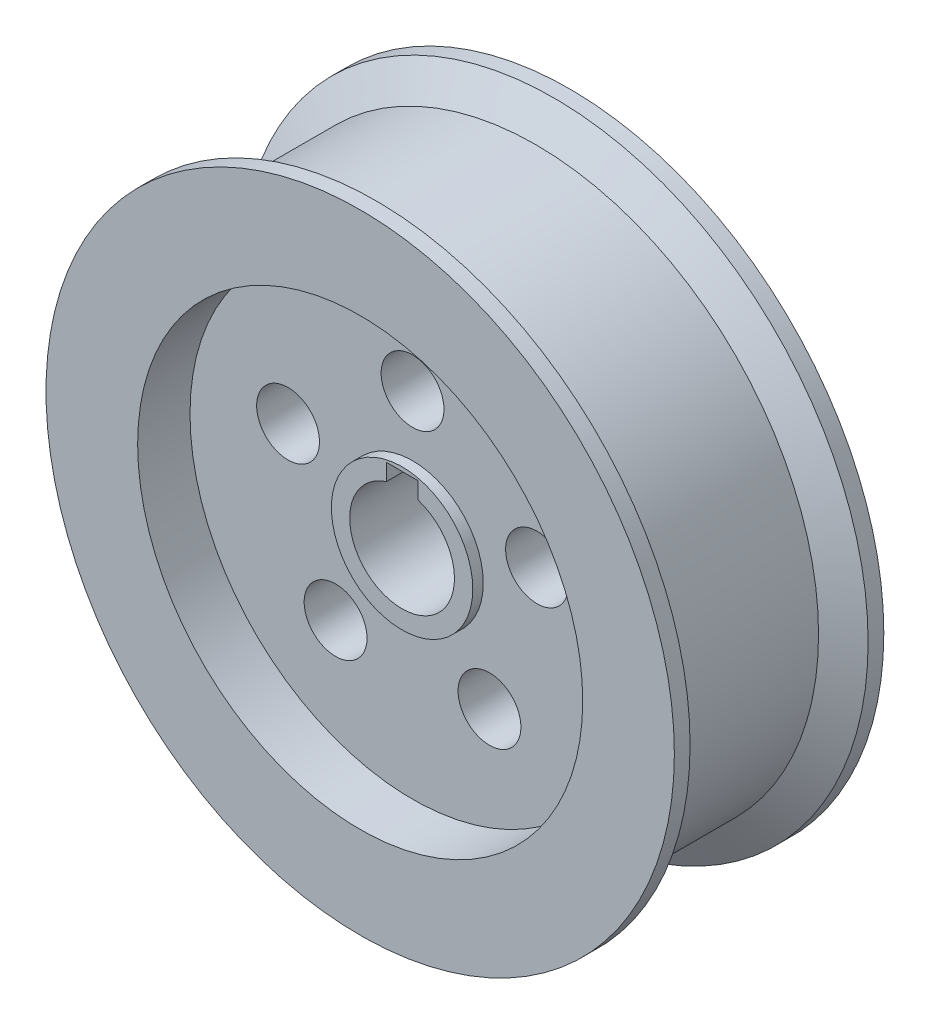
ISO-10303-21;
HEADER;
FILE_DESCRIPTION(('STEP AP214'),'2;1');
FILE_NAME('part.step','',(''),(''),'','','');
FILE_SCHEMA(('AUTOMOTIVE_DESIGN { 1 0 10303 214 1 1 1 1 }'));
ENDSEC;
DATA;
#1=APPLICATION_CONTEXT('core data for automotive mechanical design processes');
#2=APPLICATION_PROTOCOL_DEFINITION('international standard','automotive_design',2000,#1);
#3=PRODUCT_CONTEXT('',#1,'mechanical');
#4=PRODUCT('Part','Part','',(#3));
#5=PRODUCT_RELATED_PRODUCT_CATEGORY('part','',(#4));
#6=PRODUCT_DEFINITION_FORMATION('','',#4);
#7=PRODUCT_DEFINITION_CONTEXT('part definition',#1,'design');
#8=PRODUCT_DEFINITION('design','',#6,#7);
#9=PRODUCT_DEFINITION_SHAPE('','',#8);
#10=(LENGTH_UNIT() NAMED_UNIT(*) SI_UNIT(.MILLI.,.METRE.));
#11=(NAMED_UNIT(*) PLANE_ANGLE_UNIT() SI_UNIT($,.RADIAN.));
#12=(NAMED_UNIT(*) SI_UNIT($,.STERADIAN.) SOLID_ANGLE_UNIT());
#13=UNCERTAINTY_MEASURE_WITH_UNIT(LENGTH_MEASURE(1.E-05),#10,'distance_accuracy_value','');
#14=(GEOMETRIC_REPRESENTATION_CONTEXT(3) GLOBAL_UNCERTAINTY_ASSIGNED_CONTEXT((#13)) GLOBAL_UNIT_ASSIGNED_CONTEXT((#10,
#11,#12)) REPRESENTATION_CONTEXT('',''));
#15=CARTESIAN_POINT('',(0.,0.,0.));
#16=DIRECTION('',(0.,0.,1.));
#17=DIRECTION('',(1.,0.,0.));
#18=AXIS2_PLACEMENT_3D('',#15,#16,#17);
#19=CARTESIAN_POINT('',(0.,0.,20.));
#20=DIRECTION('',(0.,0.,-1.));
#21=DIRECTION('',(-1.,0.,0.));
#22=AXIS2_PLACEMENT_3D('',#19,#20,#21);
#23=CYLINDRICAL_SURFACE('',#22,60.);
#24=CARTESIAN_POINT('',(0.,0.,-17.));
#25=DIRECTION('',(0.,0.,1.));
#26=DIRECTION('',(1.,0.,0.));
#27=AXIS2_PLACEMENT_3D('',#24,#25,#26);
#28=CIRCLE('',#27,60.);
#29=CARTESIAN_POINT('',(60.,0.,-17.));
#30=VERTEX_POINT('',#29);
#31=EDGE_CURVE('E115',#30,#30,#28,.T.);
#32=ORIENTED_EDGE('',*,*,#31,.F.);
#33=EDGE_LOOP('',(#32));
#34=FACE_BOUND('',#33,.T.);
#35=CARTESIAN_POINT('',(0.,0.,-20.));
#36=DIRECTION('',(0.,0.,1.));
#37=DIRECTION('',(1.,0.,0.));
#38=AXIS2_PLACEMENT_3D('',#35,#36,#37);
#39=CIRCLE('',#38,60.);
#40=CARTESIAN_POINT('',(60.,0.,-20.));
#41=VERTEX_POINT('',#40);
#42=EDGE_CURVE('E150',#41,#41,#39,.T.);
#43=ORIENTED_EDGE('',*,*,#42,.T.);
#44=EDGE_LOOP('',(#43));
#45=FACE_BOUND('',#44,.T.);
#46=ADVANCED_FACE('F38',(#34,#45),#23,.T.);
#47=CARTESIAN_POINT('',(0.,0.,20.));
#48=DIRECTION('',(0.,0.,-1.));
#49=DIRECTION('',(-1.,0.,0.));
#50=AXIS2_PLACEMENT_3D('',#47,#48,#49);
#51=CYLINDRICAL_SURFACE('',#50,10.);
#52=DIRECTION('',(0.,0.,-1.));
#53=VECTOR('',#52,1.);
#54=CARTESIAN_POINT('',(-3.,9.53939201416946,20.));
#55=LINE('',#54,#53);
#56=CARTESIAN_POINT('',(-3.,9.53939201416946,12.));
#57=VERTEX_POINT('',#56);
#58=CARTESIAN_POINT('',(-3.,9.53939201416946,-10.));
#59=VERTEX_POINT('',#58);
#60=EDGE_CURVE('E60',#57,#59,#55,.T.);
#61=ORIENTED_EDGE('',*,*,#60,.F.);
#62=CARTESIAN_POINT('',(0.,0.,12.));
#63=DIRECTION('',(0.,0.,1.));
#64=DIRECTION('',(1.,0.,0.));
#65=AXIS2_PLACEMENT_3D('',#62,#63,#64);
#66=CIRCLE('',#65,10.);
#67=CARTESIAN_POINT('',(3.,9.53939201416946,12.));
#68=VERTEX_POINT('',#67);
#69=EDGE_CURVE('E103',#57,#68,#66,.T.);
#70=ORIENTED_EDGE('',*,*,#69,.T.);
#71=DIRECTION('',(0.,0.,-1.));
#72=VECTOR('',#71,1.);
#73=CARTESIAN_POINT('',(3.,9.53939201416946,20.));
#74=LINE('',#73,#72);
#75=CARTESIAN_POINT('',(3.,9.53939201416946,-10.));
#76=VERTEX_POINT('',#75);
#77=EDGE_CURVE('E83',#76,#68,#74,.F.);
#78=ORIENTED_EDGE('',*,*,#77,.F.);
#79=CARTESIAN_POINT('',(0.,0.,-10.));
#80=DIRECTION('',(0.,0.,-1.));
#81=DIRECTION('',(-1.,0.,0.));
#82=AXIS2_PLACEMENT_3D('',#79,#80,#81);
#83=CIRCLE('',#82,10.);
#84=EDGE_CURVE('E96',#76,#59,#83,.T.);
#85=ORIENTED_EDGE('',*,*,#84,.T.);
#86=EDGE_LOOP('',(#61,#70,#78,#85));
#87=FACE_BOUND('',#86,.T.);
#88=ADVANCED_FACE('F182',(#87),#51,.F.);
#89=CARTESIAN_POINT('',(0.,0.,20.));
#90=DIRECTION('',(0.,0.,1.));
#91=DIRECTION('',(1.,0.,0.));
#92=AXIS2_PLACEMENT_3D('',#89,#90,#91);
#93=PLANE('',#92);
#94=CARTESIAN_POINT('',(0.,0.,20.));
#95=DIRECTION('',(0.,0.,1.));
#96=DIRECTION('',(1.,0.,0.));
#97=AXIS2_PLACEMENT_3D('',#94,#95,#96);
#98=CIRCLE('',#97,42.5);
#99=CARTESIAN_POINT('',(42.5,0.,20.));
#100=VERTEX_POINT('',#99);
#101=EDGE_CURVE('E151',#100,#100,#98,.T.);
#102=ORIENTED_EDGE('',*,*,#101,.F.);
#103=EDGE_LOOP('',(#102));
#104=FACE_BOUND('',#103,.T.);
#105=CARTESIAN_POINT('',(0.,0.,20.));
#106=DIRECTION('',(0.,0.,1.));
#107=DIRECTION('',(1.,0.,0.));
#108=AXIS2_PLACEMENT_3D('',#105,#106,#107);
#109=CIRCLE('',#108,60.);
#110=CARTESIAN_POINT('',(60.,0.,20.));
#111=VERTEX_POINT('',#110);
#112=EDGE_CURVE('E154',#111,#111,#109,.T.);
#113=ORIENTED_EDGE('',*,*,#112,.T.);
#114=EDGE_LOOP('',(#113));
#115=FACE_BOUND('',#114,.T.);
#116=ADVANCED_FACE('F184',(#104,#115),#93,.T.);
#117=CARTESIAN_POINT('',(0.,0.,-20.));
#118=DIRECTION('',(0.,0.,1.));
#119=DIRECTION('',(1.,0.,0.));
#120=AXIS2_PLACEMENT_3D('',#117,#118,#119);
#121=PLANE('',#120);
#122=CARTESIAN_POINT('',(0.,0.,-20.));
#123=DIRECTION('',(0.,0.,1.));
#124=DIRECTION('',(1.,0.,0.));
#125=AXIS2_PLACEMENT_3D('',#122,#123,#124);
#126=CIRCLE('',#125,42.5);
#127=CARTESIAN_POINT('',(42.5,0.,-20.));
#128=VERTEX_POINT('',#127);
#129=EDGE_CURVE('E141',#128,#128,#126,.T.);
#130=ORIENTED_EDGE('',*,*,#129,.T.);
#131=EDGE_LOOP('',(#130));
#132=FACE_BOUND('',#131,.T.);
#133=ORIENTED_EDGE('',*,*,#42,.F.);
#134=EDGE_LOOP('',(#133));
#135=FACE_BOUND('',#134,.T.);
#136=ADVANCED_FACE('F190',(#132,#135),#121,.F.);
#137=CARTESIAN_POINT('',(0.,0.,17.));
#138=DIRECTION('',(0.,0.,1.));
#139=DIRECTION('',(1.,0.,0.));
#140=AXIS2_PLACEMENT_3D('',#137,#138,#139);
#141=CIRCLE('',#140,60.);
#142=CARTESIAN_POINT('',(60.,0.,17.));
#143=VERTEX_POINT('',#142);
#144=EDGE_CURVE('E112',#143,#143,#141,.T.);
#145=ORIENTED_EDGE('',*,*,#144,.T.);
#146=EDGE_LOOP('',(#145));
#147=FACE_BOUND('',#146,.T.);
#148=ORIENTED_EDGE('',*,*,#112,.F.);
#149=EDGE_LOOP('',(#148));
#150=FACE_BOUND('',#149,.T.);
#151=ADVANCED_FACE('F40',(#147,#150),#23,.T.);
#152=CARTESIAN_POINT('',(0.,0.,10.));
#153=DIRECTION('',(0.,0.,1.));
#154=DIRECTION('',(1.,0.,0.));
#155=AXIS2_PLACEMENT_3D('',#152,#153,#154);
#156=CYLINDRICAL_SURFACE('',#155,42.5);
#157=CARTESIAN_POINT('',(0.,0.,10.));
#158=DIRECTION('',(0.,0.,1.));
#159=DIRECTION('',(1.,0.,0.));
#160=AXIS2_PLACEMENT_3D('',#157,#158,#159);
#161=CIRCLE('',#160,42.5);
#162=CARTESIAN_POINT('',(42.5,0.,10.));
#163=VERTEX_POINT('',#162);
#164=EDGE_CURVE('E147',#163,#163,#161,.T.);
#165=ORIENTED_EDGE('',*,*,#164,.F.);
#166=EDGE_LOOP('',(#165));
#167=FACE_BOUND('',#166,.T.);
#168=ORIENTED_EDGE('',*,*,#101,.T.);
#169=EDGE_LOOP('',(#168));
#170=FACE_BOUND('',#169,.T.);
#171=ADVANCED_FACE('F195',(#167,#170),#156,.F.);
#172=CARTESIAN_POINT('',(0.,0.,10.));
#173=DIRECTION('',(0.,0.,1.));
#174=DIRECTION('',(1.,0.,0.));
#175=AXIS2_PLACEMENT_3D('',#172,#173,#174);
#176=PLANE('',#175);
#177=CARTESIAN_POINT('',(0.,0.,10.));
#178=DIRECTION('',(0.,0.,1.));
#179=DIRECTION('',(1.,0.,0.));
#180=AXIS2_PLACEMENT_3D('',#177,#178,#179);
#181=CIRCLE('',#180,13.5);
#182=CARTESIAN_POINT('',(13.5,0.,10.));
#183=VERTEX_POINT('',#182);
#184=EDGE_CURVE('E157',#183,#183,#181,.T.);
#185=ORIENTED_EDGE('',*,*,#184,.F.);
#186=EDGE_LOOP('',(#185));
#187=FACE_BOUND('',#186,.T.);
#188=CARTESIAN_POINT('',(14.6946313073117,-20.2254248593738,10.));
#189=DIRECTION('',(0.,0.,1.));
#190=DIRECTION('',(1.,0.,0.));
#191=AXIS2_PLACEMENT_3D('',#188,#189,#190);
#192=CIRCLE('',#191,6.);
#193=CARTESIAN_POINT('',(20.6946313073117,-20.2254248593738,10.));
#194=VERTEX_POINT('',#193);
#195=EDGE_CURVE('E130',#194,#194,#192,.T.);
#196=ORIENTED_EDGE('',*,*,#195,.F.);
#197=EDGE_LOOP('',(#196));
#198=FACE_BOUND('',#197,.T.);
#199=CARTESIAN_POINT('',(-14.694631307312,-20.2254248593736,10.));
#200=DIRECTION('',(0.,0.,1.));
#201=DIRECTION('',(1.,0.,0.));
#202=AXIS2_PLACEMENT_3D('',#199,#200,#201);
#203=CIRCLE('',#202,6.);
#204=CARTESIAN_POINT('',(-8.69463130731201,-20.2254248593736,10.));
#205=VERTEX_POINT('',#204);
#206=EDGE_CURVE('E126',#205,#205,#203,.T.);
#207=ORIENTED_EDGE('',*,*,#206,.F.);
#208=EDGE_LOOP('',(#207));
#209=FACE_BOUND('',#208,.T.);
#210=CARTESIAN_POINT('',(-23.7764129073788,7.72542485937396,10.));
#211=DIRECTION('',(0.,0.,1.));
#212=DIRECTION('',(1.,0.,0.));
#213=AXIS2_PLACEMENT_3D('',#210,#211,#212);
#214=CIRCLE('',#213,6.);
#215=CARTESIAN_POINT('',(-17.7764129073787,7.72542485937396,10.));
#216=VERTEX_POINT('',#215);
#217=EDGE_CURVE('E122',#216,#216,#214,.T.);
#218=ORIENTED_EDGE('',*,*,#217,.F.);
#219=EDGE_LOOP('',(#218));
#220=FACE_BOUND('',#219,.T.);
#221=CARTESIAN_POINT('',(23.7764129073789,7.72542485937362,10.));
#222=DIRECTION('',(0.,0.,1.));
#223=DIRECTION('',(1.,0.,0.));
#224=AXIS2_PLACEMENT_3D('',#221,#222,#223);
#225=CIRCLE('',#224,6.);
#226=CARTESIAN_POINT('',(29.7764129073789,7.72542485937362,10.));
#227=VERTEX_POINT('',#226);
#228=EDGE_CURVE('E134',#227,#227,#225,.T.);
#229=ORIENTED_EDGE('',*,*,#228,.F.);
#230=EDGE_LOOP('',(#229));
#231=FACE_BOUND('',#230,.T.);
#232=CARTESIAN_POINT('',(0.,25.,10.));
#233=DIRECTION('',(0.,0.,1.));
#234=DIRECTION('',(1.,0.,0.));
#235=AXIS2_PLACEMENT_3D('',#232,#233,#234);
#236=CIRCLE('',#235,6.);
#237=CARTESIAN_POINT('',(6.,25.,10.));
#238=VERTEX_POINT('',#237);
#239=EDGE_CURVE('E138',#238,#238,#236,.T.);
#240=ORIENTED_EDGE('',*,*,#239,.F.);
#241=EDGE_LOOP('',(#240));
#242=FACE_BOUND('',#241,.T.);
#243=ORIENTED_EDGE('',*,*,#164,.T.);
#244=EDGE_LOOP('',(#243));
#245=FACE_BOUND('',#244,.T.);
#246=ADVANCED_FACE('F210',(#187,#198,#209,#220,#231,#242,#245),#176,.T.);
#247=CARTESIAN_POINT('',(0.,0.,-10.));
#248=DIRECTION('',(0.,0.,-1.));
#249=DIRECTION('',(-1.,0.,0.));
#250=AXIS2_PLACEMENT_3D('',#247,#248,#249);
#251=CYLINDRICAL_SURFACE('',#250,42.5);
#252=CARTESIAN_POINT('',(0.,0.,-10.));
#253=DIRECTION('',(0.,0.,1.));
#254=DIRECTION('',(1.,0.,0.));
#255=AXIS2_PLACEMENT_3D('',#252,#253,#254);
#256=CIRCLE('',#255,42.5);
#257=CARTESIAN_POINT('',(42.5,0.,-10.));
#258=VERTEX_POINT('',#257);
#259=EDGE_CURVE('E142',#258,#258,#256,.T.);
#260=ORIENTED_EDGE('',*,*,#259,.T.);
#261=EDGE_LOOP('',(#260));
#262=FACE_BOUND('',#261,.T.);
#263=ORIENTED_EDGE('',*,*,#129,.F.);
#264=EDGE_LOOP('',(#263));
#265=FACE_BOUND('',#264,.T.);
#266=ADVANCED_FACE('F208',(#262,#265),#251,.F.);
#267=CARTESIAN_POINT('',(0.,0.,-10.));
#268=DIRECTION('',(0.,0.,-1.));
#269=DIRECTION('',(1.,0.,0.));
#270=AXIS2_PLACEMENT_3D('',#267,#268,#269);
#271=PLANE('',#270);
#272=DIRECTION('',(0.,1.,0.));
#273=VECTOR('',#272,1.);
#274=CARTESIAN_POINT('',(-3.,0.,-10.));
#275=LINE('',#274,#273);
#276=CARTESIAN_POINT('',(-3.,12.7268825510784,-10.));
#277=VERTEX_POINT('',#276);
#278=EDGE_CURVE('E98',#59,#277,#275,.T.);
#279=ORIENTED_EDGE('',*,*,#278,.F.);
#280=ORIENTED_EDGE('',*,*,#84,.F.);
#281=DIRECTION('',(0.,-1.,0.));
#282=VECTOR('',#281,1.);
#283=CARTESIAN_POINT('',(3.,0.,-10.));
#284=LINE('',#283,#282);
#285=CARTESIAN_POINT('',(3.,12.7268825510784,-10.));
#286=VERTEX_POINT('',#285);
#287=EDGE_CURVE('E87',#286,#76,#284,.T.);
#288=ORIENTED_EDGE('',*,*,#287,.F.);
#289=DIRECTION('',(1.,0.,0.));
#290=VECTOR('',#289,1.);
#291=CARTESIAN_POINT('',(0.,12.7268825510784,-10.));
#292=LINE('',#291,#290);
#293=EDGE_CURVE('E77',#277,#286,#292,.T.);
#294=ORIENTED_EDGE('',*,*,#293,.F.);
#295=EDGE_LOOP('',(#279,#280,#288,#294));
#296=FACE_BOUND('',#295,.T.);
#297=CARTESIAN_POINT('',(14.6946313073117,-20.2254248593738,-10.));
#298=DIRECTION('',(0.,0.,-1.));
#299=DIRECTION('',(-1.,0.,0.));
#300=AXIS2_PLACEMENT_3D('',#297,#298,#299);
#301=CIRCLE('',#300,6.);
#302=CARTESIAN_POINT('',(8.69463130731171,-20.2254248593738,-10.));
#303=VERTEX_POINT('',#302);
#304=EDGE_CURVE('E129',#303,#303,#301,.T.);
#305=ORIENTED_EDGE('',*,*,#304,.F.);
#306=EDGE_LOOP('',(#305));
#307=FACE_BOUND('',#306,.T.);
#308=CARTESIAN_POINT('',(-14.694631307312,-20.2254248593736,-10.));
#309=DIRECTION('',(0.,0.,-1.));
#310=DIRECTION('',(-1.,0.,0.));
#311=AXIS2_PLACEMENT_3D('',#308,#309,#310);
#312=CIRCLE('',#311,6.);
#313=CARTESIAN_POINT('',(-20.694631307312,-20.2254248593736,-10.));
#314=VERTEX_POINT('',#313);
#315=EDGE_CURVE('E125',#314,#314,#312,.T.);
#316=ORIENTED_EDGE('',*,*,#315,.F.);
#317=EDGE_LOOP('',(#316));
#318=FACE_BOUND('',#317,.T.);
#319=CARTESIAN_POINT('',(-23.7764129073788,7.72542485937396,-10.));
#320=DIRECTION('',(0.,0.,-1.));
#321=DIRECTION('',(-1.,0.,0.));
#322=AXIS2_PLACEMENT_3D('',#319,#320,#321);
#323=CIRCLE('',#322,6.);
#324=CARTESIAN_POINT('',(-29.7764129073788,7.72542485937396,-10.));
#325=VERTEX_POINT('',#324);
#326=EDGE_CURVE('E121',#325,#325,#323,.T.);
#327=ORIENTED_EDGE('',*,*,#326,.F.);
#328=EDGE_LOOP('',(#327));
#329=FACE_BOUND('',#328,.T.);
#330=CARTESIAN_POINT('',(23.7764129073789,7.72542485937362,-10.));
#331=DIRECTION('',(0.,0.,-1.));
#332=DIRECTION('',(-1.,0.,0.));
#333=AXIS2_PLACEMENT_3D('',#330,#331,#332);
#334=CIRCLE('',#333,6.);
#335=CARTESIAN_POINT('',(17.7764129073789,7.72542485937362,-10.));
#336=VERTEX_POINT('',#335);
#337=EDGE_CURVE('E133',#336,#336,#334,.T.);
#338=ORIENTED_EDGE('',*,*,#337,.F.);
#339=EDGE_LOOP('',(#338));
#340=FACE_BOUND('',#339,.T.);
#341=CARTESIAN_POINT('',(0.,25.,-10.));
#342=DIRECTION('',(0.,0.,-1.));
#343=DIRECTION('',(-1.,0.,0.));
#344=AXIS2_PLACEMENT_3D('',#341,#342,#343);
#345=CIRCLE('',#344,6.);
#346=CARTESIAN_POINT('',(-6.,25.,-10.));
#347=VERTEX_POINT('',#346);
#348=EDGE_CURVE('E137',#347,#347,#345,.T.);
#349=ORIENTED_EDGE('',*,*,#348,.F.);
#350=EDGE_LOOP('',(#349));
#351=FACE_BOUND('',#350,.T.);
#352=ORIENTED_EDGE('',*,*,#259,.F.);
#353=EDGE_LOOP('',(#352));
#354=FACE_BOUND('',#353,.T.);
#355=ADVANCED_FACE('F93',(#296,#307,#318,#329,#340,#351,#354),#271,.T.);
#356=CARTESIAN_POINT('',(0.,25.,-20.));
#357=DIRECTION('',(0.,0.,1.));
#358=DIRECTION('',(1.,0.,0.));
#359=AXIS2_PLACEMENT_3D('',#356,#357,#358);
#360=CYLINDRICAL_SURFACE('',#359,6.);
#361=ORIENTED_EDGE('',*,*,#239,.T.);
#362=EDGE_LOOP('',(#361));
#363=FACE_BOUND('',#362,.T.);
#364=ORIENTED_EDGE('',*,*,#348,.T.);
#365=EDGE_LOOP('',(#364));
#366=FACE_BOUND('',#365,.T.);
#367=ADVANCED_FACE('F217',(#363,#366),#360,.F.);
#368=CARTESIAN_POINT('',(23.7764129073789,7.72542485937362,-20.));
#369=DIRECTION('',(0.,0.,1.));
#370=DIRECTION('',(1.,0.,0.));
#371=AXIS2_PLACEMENT_3D('',#368,#369,#370);
#372=CYLINDRICAL_SURFACE('',#371,6.);
#373=ORIENTED_EDGE('',*,*,#228,.T.);
#374=EDGE_LOOP('',(#373));
#375=FACE_BOUND('',#374,.T.);
#376=ORIENTED_EDGE('',*,*,#337,.T.);
#377=EDGE_LOOP('',(#376));
#378=FACE_BOUND('',#377,.T.);
#379=ADVANCED_FACE('F223',(#375,#378),#372,.F.);
#380=CARTESIAN_POINT('',(-23.7764129073788,7.72542485937396,-20.));
#381=DIRECTION('',(0.,0.,1.));
#382=DIRECTION('',(1.,0.,0.));
#383=AXIS2_PLACEMENT_3D('',#380,#381,#382);
#384=CYLINDRICAL_SURFACE('',#383,6.);
#385=ORIENTED_EDGE('',*,*,#217,.T.);
#386=EDGE_LOOP('',(#385));
#387=FACE_BOUND('',#386,.T.);
#388=ORIENTED_EDGE('',*,*,#326,.T.);
#389=EDGE_LOOP('',(#388));
#390=FACE_BOUND('',#389,.T.);
#391=ADVANCED_FACE('F227',(#387,#390),#384,.F.);
#392=CARTESIAN_POINT('',(-14.694631307312,-20.2254248593736,-20.));
#393=DIRECTION('',(0.,0.,1.));
#394=DIRECTION('',(1.,0.,0.));
#395=AXIS2_PLACEMENT_3D('',#392,#393,#394);
#396=CYLINDRICAL_SURFACE('',#395,6.);
#397=ORIENTED_EDGE('',*,*,#206,.T.);
#398=EDGE_LOOP('',(#397));
#399=FACE_BOUND('',#398,.T.);
#400=ORIENTED_EDGE('',*,*,#315,.T.);
#401=EDGE_LOOP('',(#400));
#402=FACE_BOUND('',#401,.T.);
#403=ADVANCED_FACE('F231',(#399,#402),#396,.F.);
#404=CARTESIAN_POINT('',(14.6946313073117,-20.2254248593738,-20.));
#405=DIRECTION('',(0.,0.,1.));
#406=DIRECTION('',(1.,0.,0.));
#407=AXIS2_PLACEMENT_3D('',#404,#405,#406);
#408=CYLINDRICAL_SURFACE('',#407,6.);
#409=ORIENTED_EDGE('',*,*,#195,.T.);
#410=EDGE_LOOP('',(#409));
#411=FACE_BOUND('',#410,.T.);
#412=ORIENTED_EDGE('',*,*,#304,.T.);
#413=EDGE_LOOP('',(#412));
#414=FACE_BOUND('',#413,.T.);
#415=ADVANCED_FACE('F235',(#411,#414),#408,.F.);
#416=CARTESIAN_POINT('',(0.,0.,0.));
#417=DIRECTION('',(0.,0.,1.));
#418=DIRECTION('',(1.,0.,0.));
#419=AXIS2_PLACEMENT_3D('',#416,#417,#418);
#420=CYLINDRICAL_SURFACE('',#419,54.);
#421=CARTESIAN_POINT('',(0.,0.,13.5358983848622));
#422=DIRECTION('',(0.,0.,1.));
#423=DIRECTION('',(1.,0.,0.));
#424=AXIS2_PLACEMENT_3D('',#421,#422,#423);
#425=CIRCLE('',#424,54.);
#426=CARTESIAN_POINT('',(54.,0.,13.5358983848622));
#427=VERTEX_POINT('',#426);
#428=EDGE_CURVE('E109',#427,#427,#425,.T.);
#429=ORIENTED_EDGE('',*,*,#428,.F.);
#430=EDGE_LOOP('',(#429));
#431=FACE_BOUND('',#430,.T.);
#432=CARTESIAN_POINT('',(0.,0.,-13.5358983848622));
#433=DIRECTION('',(0.,0.,1.));
#434=DIRECTION('',(1.,0.,0.));
#435=AXIS2_PLACEMENT_3D('',#432,#433,#434);
#436=CIRCLE('',#435,54.);
#437=CARTESIAN_POINT('',(54.,0.,-13.5358983848622));
#438=VERTEX_POINT('',#437);
#439=EDGE_CURVE('E118',#438,#438,#436,.T.);
#440=ORIENTED_EDGE('',*,*,#439,.T.);
#441=EDGE_LOOP('',(#440));
#442=FACE_BOUND('',#441,.T.);
#443=ADVANCED_FACE('F239',(#431,#442),#420,.T.);
#444=CARTESIAN_POINT('',(0.,0.,-17.));
#445=DIRECTION('',(0.,0.,-1.));
#446=DIRECTION('',(-1.,0.,0.));
#447=AXIS2_PLACEMENT_3D('',#444,#445,#446);
#448=CONICAL_SURFACE('',#447,60.,1.04719755119659);
#449=ORIENTED_EDGE('',*,*,#439,.F.);
#450=EDGE_LOOP('',(#449));
#451=FACE_BOUND('',#450,.T.);
#452=ORIENTED_EDGE('',*,*,#31,.T.);
#453=EDGE_LOOP('',(#452));
#454=FACE_BOUND('',#453,.T.);
#455=ADVANCED_FACE('F243',(#451,#454),#448,.T.);
#456=CARTESIAN_POINT('',(0.,0.,13.5358983848622));
#457=DIRECTION('',(0.,0.,1.));
#458=DIRECTION('',(1.,0.,0.));
#459=AXIS2_PLACEMENT_3D('',#456,#457,#458);
#460=CONICAL_SURFACE('',#459,54.,1.04719755119659);
#461=ORIENTED_EDGE('',*,*,#144,.F.);
#462=EDGE_LOOP('',(#461));
#463=FACE_BOUND('',#462,.T.);
#464=ORIENTED_EDGE('',*,*,#428,.T.);
#465=EDGE_LOOP('',(#464));
#466=FACE_BOUND('',#465,.T.);
#467=ADVANCED_FACE('F247',(#463,#466),#460,.T.);
#468=CARTESIAN_POINT('',(0.,0.,3.));
#469=DIRECTION('',(0.,0.,1.));
#470=DIRECTION('',(1.,0.,0.));
#471=AXIS2_PLACEMENT_3D('',#468,#469,#470);
#472=CYLINDRICAL_SURFACE('',#471,13.5);
#473=ORIENTED_EDGE('',*,*,#184,.T.);
#474=EDGE_LOOP('',(#473));
#475=FACE_BOUND('',#474,.T.);
#476=CARTESIAN_POINT('',(0.,0.,12.));
#477=DIRECTION('',(0.,0.,1.));
#478=DIRECTION('',(1.,0.,0.));
#479=AXIS2_PLACEMENT_3D('',#476,#477,#478);
#480=CIRCLE('',#479,13.5);
#481=CARTESIAN_POINT('',(13.5,0.,12.));
#482=VERTEX_POINT('',#481);
#483=EDGE_CURVE('E106',#482,#482,#480,.T.);
#484=ORIENTED_EDGE('',*,*,#483,.F.);
#485=EDGE_LOOP('',(#484));
#486=FACE_BOUND('',#485,.T.);
#487=ADVANCED_FACE('F251',(#475,#486),#472,.T.);
#488=CARTESIAN_POINT('',(0.,0.,12.));
#489=DIRECTION('',(0.,0.,1.));
#490=DIRECTION('',(1.,0.,0.));
#491=AXIS2_PLACEMENT_3D('',#488,#489,#490);
#492=PLANE('',#491);
#493=DIRECTION('',(0.,-1.,0.));
#494=VECTOR('',#493,1.);
#495=CARTESIAN_POINT('',(-3.,0.,12.));
#496=LINE('',#495,#494);
#497=CARTESIAN_POINT('',(-3.,12.7268825510784,12.));
#498=VERTEX_POINT('',#497);
#499=EDGE_CURVE('E11',#498,#57,#496,.T.);
#500=ORIENTED_EDGE('',*,*,#499,.F.);
#501=DIRECTION('',(-1.,0.,0.));
#502=VECTOR('',#501,1.);
#503=CARTESIAN_POINT('',(0.,12.7268825510784,12.));
#504=LINE('',#503,#502);
#505=CARTESIAN_POINT('',(3.,12.7268825510784,12.));
#506=VERTEX_POINT('',#505);
#507=EDGE_CURVE('E173',#506,#498,#504,.T.);
#508=ORIENTED_EDGE('',*,*,#507,.F.);
#509=DIRECTION('',(0.,1.,0.));
#510=VECTOR('',#509,1.);
#511=CARTESIAN_POINT('',(3.,0.,12.));
#512=LINE('',#511,#510);
#513=EDGE_CURVE('E46',#68,#506,#512,.T.);
#514=ORIENTED_EDGE('',*,*,#513,.F.);
#515=ORIENTED_EDGE('',*,*,#69,.F.);
#516=EDGE_LOOP('',(#500,#508,#514,#515));
#517=FACE_BOUND('',#516,.T.);
#518=ORIENTED_EDGE('',*,*,#483,.T.);
#519=EDGE_LOOP('',(#518));
#520=FACE_BOUND('',#519,.T.);
#521=ADVANCED_FACE('F179',(#517,#520),#492,.T.);
#522=CARTESIAN_POINT('',(-3.,9.51688255107839,20.));
#523=DIRECTION('',(-1.,0.,0.));
#524=DIRECTION('',(0.,0.,1.));
#525=AXIS2_PLACEMENT_3D('',#522,#523,#524);
#526=PLANE('',#525);
#527=ORIENTED_EDGE('',*,*,#278,.T.);
#528=DIRECTION('',(0.,0.,-1.));
#529=VECTOR('',#528,1.);
#530=CARTESIAN_POINT('',(-3.,12.7268825510784,20.));
#531=LINE('',#530,#529);
#532=EDGE_CURVE('E80',#498,#277,#531,.T.);
#533=ORIENTED_EDGE('',*,*,#532,.F.);
#534=ORIENTED_EDGE('',*,*,#499,.T.);
#535=ORIENTED_EDGE('',*,*,#60,.T.);
#536=EDGE_LOOP('',(#527,#533,#534,#535));
#537=FACE_BOUND('',#536,.T.);
#538=ADVANCED_FACE('F176',(#537),#526,.F.);
#539=CARTESIAN_POINT('',(3.,9.51688255107839,20.));
#540=DIRECTION('',(1.,0.,0.));
#541=DIRECTION('',(0.,1.,0.));
#542=AXIS2_PLACEMENT_3D('',#539,#540,#541);
#543=PLANE('',#542);
#544=ORIENTED_EDGE('',*,*,#287,.T.);
#545=ORIENTED_EDGE('',*,*,#77,.T.);
#546=ORIENTED_EDGE('',*,*,#513,.T.);
#547=DIRECTION('',(0.,0.,-1.));
#548=VECTOR('',#547,1.);
#549=CARTESIAN_POINT('',(3.,12.7268825510784,20.));
#550=LINE('',#549,#548);
#551=EDGE_CURVE('E53',#506,#286,#550,.T.);
#552=ORIENTED_EDGE('',*,*,#551,.T.);
#553=EDGE_LOOP('',(#544,#545,#546,#552));
#554=FACE_BOUND('',#553,.T.);
#555=ADVANCED_FACE('F86',(#554),#543,.F.);
#556=CARTESIAN_POINT('',(3.,12.7268825510784,20.));
#557=DIRECTION('',(0.,1.,0.));
#558=DIRECTION('',(0.,0.,1.));
#559=AXIS2_PLACEMENT_3D('',#556,#557,#558);
#560=PLANE('',#559);
#561=ORIENTED_EDGE('',*,*,#293,.T.);
#562=ORIENTED_EDGE('',*,*,#551,.F.);
#563=ORIENTED_EDGE('',*,*,#507,.T.);
#564=ORIENTED_EDGE('',*,*,#532,.T.);
#565=EDGE_LOOP('',(#561,#562,#563,#564));
#566=FACE_BOUND('',#565,.T.);
#567=ADVANCED_FACE('F78',(#566),#560,.F.);
#568=CLOSED_SHELL('',(#46,#88,#116,#136,#151,#171,#246,#266,#355,#367,#379,#391,#403,#415,#443,
#455,#467,#487,#521,#538,#555,#567));
#569=MANIFOLD_SOLID_BREP('B2',#568);
#570=ADVANCED_BREP_SHAPE_REPRESENTATION('',(#18,#569),#14);
#571=SHAPE_DEFINITION_REPRESENTATION(#9,#570);
ENDSEC;
END-ISO-10303-21;
